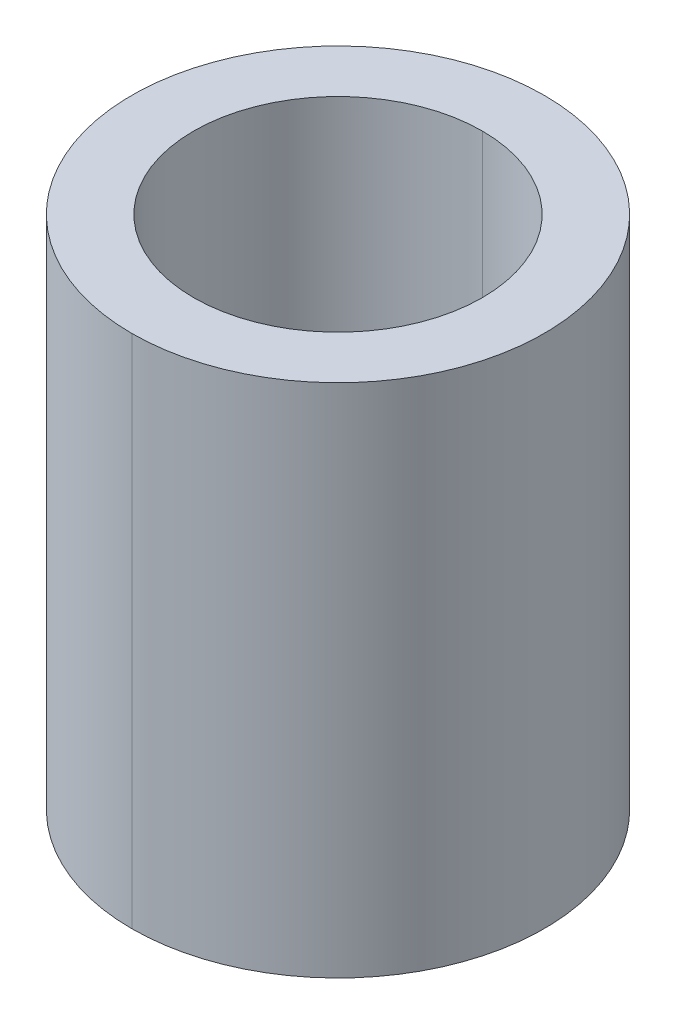
ISO-10303-21;
HEADER;
FILE_DESCRIPTION(('STEP AP214'),'2;1');
FILE_NAME('part.step','',(''),(''),'','','');
FILE_SCHEMA(('AUTOMOTIVE_DESIGN { 1 0 10303 214 1 1 1 1 }'));
ENDSEC;
DATA;
#1=APPLICATION_CONTEXT('core data for automotive mechanical design processes');
#2=APPLICATION_PROTOCOL_DEFINITION('international standard','automotive_design',2000,#1);
#3=PRODUCT_CONTEXT('',#1,'mechanical');
#4=PRODUCT('Part','Part','',(#3));
#5=PRODUCT_RELATED_PRODUCT_CATEGORY('part','',(#4));
#6=PRODUCT_DEFINITION_FORMATION('','',#4);
#7=PRODUCT_DEFINITION_CONTEXT('part definition',#1,'design');
#8=PRODUCT_DEFINITION('design','',#6,#7);
#9=PRODUCT_DEFINITION_SHAPE('','',#8);
#10=(LENGTH_UNIT() NAMED_UNIT(*) SI_UNIT(.MILLI.,.METRE.));
#11=(NAMED_UNIT(*) PLANE_ANGLE_UNIT() SI_UNIT($,.RADIAN.));
#12=(NAMED_UNIT(*) SI_UNIT($,.STERADIAN.) SOLID_ANGLE_UNIT());
#13=UNCERTAINTY_MEASURE_WITH_UNIT(LENGTH_MEASURE(1.E-05),#10,'distance_accuracy_value','');
#14=(GEOMETRIC_REPRESENTATION_CONTEXT(3) GLOBAL_UNCERTAINTY_ASSIGNED_CONTEXT((#13)) GLOBAL_UNIT_ASSIGNED_CONTEXT((#10,
#11,#12)) REPRESENTATION_CONTEXT('',''));
#15=CARTESIAN_POINT('',(0.,0.,0.));
#16=DIRECTION('',(0.,0.,1.));
#17=DIRECTION('',(1.,0.,0.));
#18=AXIS2_PLACEMENT_3D('',#15,#16,#17);
#19=CARTESIAN_POINT('',(0.,5.,0.));
#20=DIRECTION('',(0.,-1.,0.));
#21=DIRECTION('',(0.,0.,-1.));
#22=AXIS2_PLACEMENT_3D('',#19,#20,#21);
#23=CYLINDRICAL_SURFACE('',#22,1.4);
#24=DIRECTION('',(0.,-1.,0.));
#25=VECTOR('',#24,1.);
#26=CARTESIAN_POINT('',(0.,5.,1.4));
#27=LINE('',#26,#25);
#28=CARTESIAN_POINT('',(0.,5.,1.4));
#29=VERTEX_POINT('',#28);
#30=CARTESIAN_POINT('',(0.,0.,1.4));
#31=VERTEX_POINT('',#30);
#32=EDGE_CURVE('E253',#29,#31,#27,.T.);
#33=ORIENTED_EDGE('',*,*,#32,.F.);
#34=CARTESIAN_POINT('',(0.,5.,0.));
#35=DIRECTION('',(0.,1.,0.));
#36=DIRECTION('',(0.,0.,1.));
#37=AXIS2_PLACEMENT_3D('',#34,#35,#36);
#38=CIRCLE('',#37,1.4);
#39=CARTESIAN_POINT('',(0.,5.,-1.4));
#40=VERTEX_POINT('',#39);
#41=EDGE_CURVE('E66',#29,#40,#38,.T.);
#42=ORIENTED_EDGE('',*,*,#41,.T.);
#43=DIRECTION('',(0.,-1.,0.));
#44=VECTOR('',#43,1.);
#45=CARTESIAN_POINT('',(0.,5.,-1.4));
#46=LINE('',#45,#44);
#47=CARTESIAN_POINT('',(0.,0.,-1.4));
#48=VERTEX_POINT('',#47);
#49=EDGE_CURVE('E76',#40,#48,#46,.T.);
#50=ORIENTED_EDGE('',*,*,#49,.T.);
#51=CARTESIAN_POINT('',(0.,0.,0.));
#52=DIRECTION('',(0.,1.,0.));
#53=DIRECTION('',(0.,0.,1.));
#54=AXIS2_PLACEMENT_3D('',#51,#52,#53);
#55=CIRCLE('',#54,1.4);
#56=EDGE_CURVE('E10',#31,#48,#55,.T.);
#57=ORIENTED_EDGE('',*,*,#56,.F.);
#58=EDGE_LOOP('',(#33,#42,#50,#57));
#59=FACE_BOUND('',#58,.T.);
#60=ADVANCED_FACE('F16',(#59),#23,.F.);
#61=CARTESIAN_POINT('',(0.,5.,0.));
#62=DIRECTION('',(0.,-1.,0.));
#63=DIRECTION('',(0.,0.,-1.));
#64=AXIS2_PLACEMENT_3D('',#61,#62,#63);
#65=CYLINDRICAL_SURFACE('',#64,2.);
#66=DIRECTION('',(0.,-1.,0.));
#67=VECTOR('',#66,1.);
#68=CARTESIAN_POINT('',(0.,5.,2.));
#69=LINE('',#68,#67);
#70=CARTESIAN_POINT('',(0.,5.,2.));
#71=VERTEX_POINT('',#70);
#72=CARTESIAN_POINT('',(0.,0.,2.));
#73=VERTEX_POINT('',#72);
#74=EDGE_CURVE('E61',#71,#73,#69,.T.);
#75=ORIENTED_EDGE('',*,*,#74,.F.);
#76=CARTESIAN_POINT('',(0.,5.,0.));
#77=DIRECTION('',(0.,1.,0.));
#78=DIRECTION('',(0.,0.,1.));
#79=AXIS2_PLACEMENT_3D('',#76,#77,#78);
#80=CIRCLE('',#79,2.);
#81=CARTESIAN_POINT('',(0.,5.,-2.));
#82=VERTEX_POINT('',#81);
#83=EDGE_CURVE('E55',#82,#71,#80,.T.);
#84=ORIENTED_EDGE('',*,*,#83,.F.);
#85=DIRECTION('',(0.,-1.,0.));
#86=VECTOR('',#85,1.);
#87=CARTESIAN_POINT('',(0.,5.,-2.));
#88=LINE('',#87,#86);
#89=CARTESIAN_POINT('',(0.,0.,-2.));
#90=VERTEX_POINT('',#89);
#91=EDGE_CURVE('E58',#82,#90,#88,.T.);
#92=ORIENTED_EDGE('',*,*,#91,.T.);
#93=CARTESIAN_POINT('',(0.,0.,0.));
#94=DIRECTION('',(0.,1.,0.));
#95=DIRECTION('',(0.,0.,1.));
#96=AXIS2_PLACEMENT_3D('',#93,#94,#95);
#97=CIRCLE('',#96,2.);
#98=EDGE_CURVE('E25',#90,#73,#97,.T.);
#99=ORIENTED_EDGE('',*,*,#98,.T.);
#100=EDGE_LOOP('',(#75,#84,#92,#99));
#101=FACE_BOUND('',#100,.T.);
#102=ADVANCED_FACE('F57',(#101),#65,.T.);
#103=CARTESIAN_POINT('',(0.,0.,0.));
#104=DIRECTION('',(0.,1.,0.));
#105=DIRECTION('',(1.,0.,0.));
#106=AXIS2_PLACEMENT_3D('',#103,#104,#105);
#107=PLANE('',#106);
#108=CARTESIAN_POINT('',(0.,0.,0.));
#109=DIRECTION('',(0.,1.,0.));
#110=DIRECTION('',(0.,0.,1.));
#111=AXIS2_PLACEMENT_3D('',#108,#109,#110);
#112=CIRCLE('',#111,1.4);
#113=EDGE_CURVE('E85',#48,#31,#112,.T.);
#114=ORIENTED_EDGE('',*,*,#113,.T.);
#115=ORIENTED_EDGE('',*,*,#56,.T.);
#116=EDGE_LOOP('',(#114,#115));
#117=FACE_BOUND('',#116,.T.);
#118=ORIENTED_EDGE('',*,*,#98,.F.);
#119=CARTESIAN_POINT('',(0.,0.,0.));
#120=DIRECTION('',(0.,1.,0.));
#121=DIRECTION('',(0.,0.,1.));
#122=AXIS2_PLACEMENT_3D('',#119,#120,#121);
#123=CIRCLE('',#122,2.);
#124=EDGE_CURVE('E71',#73,#90,#123,.T.);
#125=ORIENTED_EDGE('',*,*,#124,.F.);
#126=EDGE_LOOP('',(#118,#125));
#127=FACE_BOUND('',#126,.T.);
#128=ADVANCED_FACE('F129',(#117,#127),#107,.F.);
#129=CARTESIAN_POINT('',(0.,5.,0.));
#130=DIRECTION('',(0.,1.,0.));
#131=DIRECTION('',(1.,0.,0.));
#132=AXIS2_PLACEMENT_3D('',#129,#130,#131);
#133=PLANE('',#132);
#134=CARTESIAN_POINT('',(0.,5.,0.));
#135=DIRECTION('',(0.,1.,0.));
#136=DIRECTION('',(0.,0.,1.));
#137=AXIS2_PLACEMENT_3D('',#134,#135,#136);
#138=CIRCLE('',#137,1.4);
#139=EDGE_CURVE('E259',#40,#29,#138,.T.);
#140=ORIENTED_EDGE('',*,*,#139,.F.);
#141=ORIENTED_EDGE('',*,*,#41,.F.);
#142=EDGE_LOOP('',(#140,#141));
#143=FACE_BOUND('',#142,.T.);
#144=ORIENTED_EDGE('',*,*,#83,.T.);
#145=CARTESIAN_POINT('',(0.,5.,0.));
#146=DIRECTION('',(0.,1.,0.));
#147=DIRECTION('',(0.,0.,1.));
#148=AXIS2_PLACEMENT_3D('',#145,#146,#147);
#149=CIRCLE('',#148,2.);
#150=EDGE_CURVE('E70',#71,#82,#149,.T.);
#151=ORIENTED_EDGE('',*,*,#150,.T.);
#152=EDGE_LOOP('',(#144,#151));
#153=FACE_BOUND('',#152,.T.);
#154=ADVANCED_FACE('F74',(#143,#153),#133,.T.);
#155=CARTESIAN_POINT('',(0.,5.,0.));
#156=DIRECTION('',(0.,-1.,0.));
#157=DIRECTION('',(0.,0.,-1.));
#158=AXIS2_PLACEMENT_3D('',#155,#156,#157);
#159=CYLINDRICAL_SURFACE('',#158,2.);
#160=ORIENTED_EDGE('',*,*,#150,.F.);
#161=ORIENTED_EDGE('',*,*,#74,.T.);
#162=ORIENTED_EDGE('',*,*,#124,.T.);
#163=ORIENTED_EDGE('',*,*,#91,.F.);
#164=EDGE_LOOP('',(#160,#161,#162,#163));
#165=FACE_BOUND('',#164,.T.);
#166=ADVANCED_FACE('F69',(#165),#159,.T.);
#167=CARTESIAN_POINT('',(0.,5.,0.));
#168=DIRECTION('',(0.,-1.,0.));
#169=DIRECTION('',(0.,0.,-1.));
#170=AXIS2_PLACEMENT_3D('',#167,#168,#169);
#171=CYLINDRICAL_SURFACE('',#170,1.4);
#172=ORIENTED_EDGE('',*,*,#139,.T.);
#173=ORIENTED_EDGE('',*,*,#32,.T.);
#174=ORIENTED_EDGE('',*,*,#113,.F.);
#175=ORIENTED_EDGE('',*,*,#49,.F.);
#176=EDGE_LOOP('',(#172,#173,#174,#175));
#177=FACE_BOUND('',#176,.T.);
#178=ADVANCED_FACE('F104',(#177),#171,.F.);
#179=CLOSED_SHELL('',(#60,#102,#128,#154,#166,#178));
#180=MANIFOLD_SOLID_BREP('B1',#179);
#181=ADVANCED_BREP_SHAPE_REPRESENTATION('',(#18,#180),#14);
#182=SHAPE_DEFINITION_REPRESENTATION(#9,#181);
ENDSEC;
END-ISO-10303-21;
